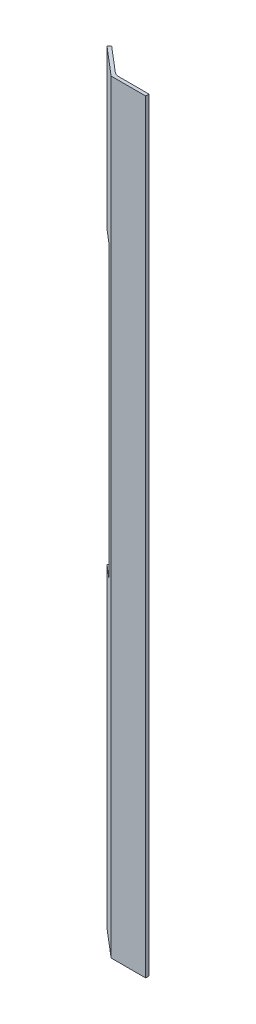
ISO-10303-21;
HEADER;
FILE_DESCRIPTION(('STEP AP214'),'2;1');
FILE_NAME('part.step','',(''),(''),'','','');
FILE_SCHEMA(('AUTOMOTIVE_DESIGN { 1 0 10303 214 1 1 1 1 }'));
ENDSEC;
DATA;
#1=APPLICATION_CONTEXT('core data for automotive mechanical design processes');
#2=APPLICATION_PROTOCOL_DEFINITION('international standard','automotive_design',2000,#1);
#3=PRODUCT_CONTEXT('',#1,'mechanical');
#4=PRODUCT('Part','Part','',(#3));
#5=PRODUCT_RELATED_PRODUCT_CATEGORY('part','',(#4));
#6=PRODUCT_DEFINITION_FORMATION('','',#4);
#7=PRODUCT_DEFINITION_CONTEXT('part definition',#1,'design');
#8=PRODUCT_DEFINITION('design','',#6,#7);
#9=PRODUCT_DEFINITION_SHAPE('','',#8);
#10=(LENGTH_UNIT() NAMED_UNIT(*) SI_UNIT(.MILLI.,.METRE.));
#11=(NAMED_UNIT(*) PLANE_ANGLE_UNIT() SI_UNIT($,.RADIAN.));
#12=(NAMED_UNIT(*) SI_UNIT($,.STERADIAN.) SOLID_ANGLE_UNIT());
#13=UNCERTAINTY_MEASURE_WITH_UNIT(LENGTH_MEASURE(1.E-05),#10,'distance_accuracy_value','');
#14=(GEOMETRIC_REPRESENTATION_CONTEXT(3) GLOBAL_UNCERTAINTY_ASSIGNED_CONTEXT((#13)) GLOBAL_UNIT_ASSIGNED_CONTEXT((#10,
#11,#12)) REPRESENTATION_CONTEXT('',''));
#15=CARTESIAN_POINT('',(0.,0.,0.));
#16=DIRECTION('',(0.,0.,1.));
#17=DIRECTION('',(1.,0.,0.));
#18=AXIS2_PLACEMENT_3D('',#15,#16,#17);
#19=CARTESIAN_POINT('',(-20.5084475648758,500.,-12.792651291369));
#20=DIRECTION('',(0.761435198515556,0.,0.648241034231539));
#21=DIRECTION('',(0.648241034231539,0.,-0.761435198515556));
#22=AXIS2_PLACEMENT_3D('',#19,#20,#21);
#23=PLANE('',#22);
#24=DIRECTION('',(0.,-1.,0.));
#25=VECTOR('',#24,1.);
#26=CARTESIAN_POINT('',(-19.2119654964128,500.,-14.3155216884001));
#27=LINE('',#26,#25);
#28=CARTESIAN_POINT('',(-19.2119654964128,500.,-14.3155216884001));
#29=VERTEX_POINT('',#28);
#30=CARTESIAN_POINT('',(-19.2119654964128,404.597692816823,-14.3155216884001));
#31=VERTEX_POINT('',#30);
#32=EDGE_CURVE('E158',#29,#31,#27,.T.);
#33=ORIENTED_EDGE('',*,*,#32,.T.);
#34=DIRECTION('',(-0.648241034231539,0.,0.761435198515556));
#35=VECTOR('',#34,1.);
#36=CARTESIAN_POINT('',(-20.5084475648758,404.597692816823,-12.792651291369));
#37=LINE('',#36,#35);
#38=CARTESIAN_POINT('',(-20.5084475648758,404.597692816823,-12.792651291369));
#39=VERTEX_POINT('',#38);
#40=EDGE_CURVE('E195',#31,#39,#37,.T.);
#41=ORIENTED_EDGE('',*,*,#40,.T.);
#42=DIRECTION('',(0.,-1.,0.));
#43=VECTOR('',#42,1.);
#44=CARTESIAN_POINT('',(-20.5084475648758,500.,-12.792651291369));
#45=LINE('',#44,#43);
#46=CARTESIAN_POINT('',(-20.5084475648758,500.,-12.792651291369));
#47=VERTEX_POINT('',#46);
#48=EDGE_CURVE('E154',#47,#39,#45,.T.);
#49=ORIENTED_EDGE('',*,*,#48,.F.);
#50=DIRECTION('',(-0.648241034231539,0.,0.761435198515556));
#51=VECTOR('',#50,1.);
#52=CARTESIAN_POINT('',(-20.5084475648758,500.,-12.792651291369));
#53=LINE('',#52,#51);
#54=EDGE_CURVE('E205',#29,#47,#53,.T.);
#55=ORIENTED_EDGE('',*,*,#54,.F.);
#56=EDGE_LOOP('',(#33,#41,#49,#55));
#57=FACE_BOUND('',#56,.T.);
#58=ADVANCED_FACE('F31',(#57),#23,.F.);
#59=CARTESIAN_POINT('',(-1.13337922469441,500.,-5.48688166985293));
#60=DIRECTION('',(0.,-1.,0.));
#61=DIRECTION('',(0.,0.,-1.));
#62=AXIS2_PLACEMENT_3D('',#59,#60,#61);
#63=CYLINDRICAL_SURFACE('',#62,5.);
#64=CARTESIAN_POINT('',(-1.13337922469441,40.,-5.48688166985293));
#65=DIRECTION('',(0.,-1.,0.));
#66=DIRECTION('',(0.,0.,-1.));
#67=AXIS2_PLACEMENT_3D('',#64,#65,#66);
#68=CIRCLE('',#67,5.);
#69=CARTESIAN_POINT('',(-1.13337922469441,40.,-0.486881669852926));
#70=VERTEX_POINT('',#69);
#71=CARTESIAN_POINT('',(-4.37520085986418,40.,-1.68023058448337));
#72=VERTEX_POINT('',#71);
#73=EDGE_CURVE('E133',#70,#72,#68,.T.);
#74=ORIENTED_EDGE('',*,*,#73,.T.);
#75=DIRECTION('',(0.,-1.,0.));
#76=VECTOR('',#75,1.);
#77=CARTESIAN_POINT('',(-4.37520085986418,500.,-1.68023058448337));
#78=LINE('',#77,#76);
#79=CARTESIAN_POINT('',(-4.37520085986418,500.,-1.68023058448337));
#80=VERTEX_POINT('',#79);
#81=EDGE_CURVE('E39',#80,#72,#78,.T.);
#82=ORIENTED_EDGE('',*,*,#81,.F.);
#83=CARTESIAN_POINT('',(-1.13337922469441,500.,-5.48688166985293));
#84=DIRECTION('',(0.,-1.,0.));
#85=DIRECTION('',(0.,0.,-1.));
#86=AXIS2_PLACEMENT_3D('',#83,#84,#85);
#87=CIRCLE('',#86,5.);
#88=CARTESIAN_POINT('',(-1.13337922469441,500.,-0.486881669852926));
#89=VERTEX_POINT('',#88);
#90=EDGE_CURVE('E149',#89,#80,#87,.T.);
#91=ORIENTED_EDGE('',*,*,#90,.F.);
#92=DIRECTION('',(0.,-1.,0.));
#93=VECTOR('',#92,1.);
#94=CARTESIAN_POINT('',(-1.13337922469441,500.,-0.486881669852926));
#95=LINE('',#94,#93);
#96=EDGE_CURVE('E129',#89,#70,#95,.T.);
#97=ORIENTED_EDGE('',*,*,#96,.T.);
#98=EDGE_LOOP('',(#74,#82,#91,#97));
#99=FACE_BOUND('',#98,.T.);
#100=ADVANCED_FACE('F33',(#99),#63,.F.);
#101=CARTESIAN_POINT('',(-19.2119654964128,500.,-14.3155216884001));
#102=DIRECTION('',(-0.648364327033953,0.,0.761330217073911));
#103=DIRECTION('',(0.761330217073912,0.,0.648364327033953));
#104=AXIS2_PLACEMENT_3D('',#101,#102,#103);
#105=PLANE('',#104);
#106=DIRECTION('',(0.,1.,0.));
#107=VECTOR('',#106,1.);
#108=CARTESIAN_POINT('',(-11.9974834467986,500.,-8.17152176025525));
#109=LINE('',#108,#107);
#110=CARTESIAN_POINT('',(-11.9974834467986,229.635760448528,-8.17152176025523));
#111=VERTEX_POINT('',#110);
#112=CARTESIAN_POINT('',(-11.9974834467986,404.597692816823,-8.17152176025524));
#113=VERTEX_POINT('',#112);
#114=EDGE_CURVE('E201',#111,#113,#109,.T.);
#115=ORIENTED_EDGE('',*,*,#114,.T.);
#116=DIRECTION('',(-0.761330217073912,0.,-0.648364327033953));
#117=VECTOR('',#116,1.);
#118=CARTESIAN_POINT('',(-19.2119654964128,404.597692816823,-14.3155216884001));
#119=LINE('',#118,#117);
#120=EDGE_CURVE('E137',#113,#31,#119,.T.);
#121=ORIENTED_EDGE('',*,*,#120,.T.);
#122=ORIENTED_EDGE('',*,*,#32,.F.);
#123=DIRECTION('',(-0.761330217073912,0.,-0.648364327033953));
#124=VECTOR('',#123,1.);
#125=CARTESIAN_POINT('',(-19.2119654964128,500.,-14.3155216884001));
#126=LINE('',#125,#124);
#127=EDGE_CURVE('E93',#80,#29,#126,.T.);
#128=ORIENTED_EDGE('',*,*,#127,.F.);
#129=ORIENTED_EDGE('',*,*,#81,.T.);
#130=DIRECTION('',(-0.761330217073912,0.,-0.648364327033953));
#131=VECTOR('',#130,1.);
#132=CARTESIAN_POINT('',(-19.2119654964128,40.,-14.3155216884001));
#133=LINE('',#132,#131);
#134=CARTESIAN_POINT('',(-19.2119654964128,40.,-14.3155216884001));
#135=VERTEX_POINT('',#134);
#136=EDGE_CURVE('E136',#72,#135,#133,.T.);
#137=ORIENTED_EDGE('',*,*,#136,.T.);
#138=CARTESIAN_POINT('',(-19.2119654964128,229.635760448528,-14.3155216884001));
#139=VERTEX_POINT('',#138);
#140=EDGE_CURVE('E157',#139,#135,#27,.T.);
#141=ORIENTED_EDGE('',*,*,#140,.F.);
#142=DIRECTION('',(0.761330217073912,0.,0.648364327033953));
#143=VECTOR('',#142,1.);
#144=CARTESIAN_POINT('',(-19.2119654964128,229.635760448528,-14.3155216884001));
#145=LINE('',#144,#143);
#146=EDGE_CURVE('E177',#139,#111,#145,.T.);
#147=ORIENTED_EDGE('',*,*,#146,.T.);
#148=EDGE_LOOP('',(#115,#121,#122,#128,#129,#137,#141,#147));
#149=FACE_BOUND('',#148,.T.);
#150=ADVANCED_FACE('F162',(#149),#105,.F.);
#151=CARTESIAN_POINT('',(-20.5084475648758,229.635760448528,-12.792651291369));
#152=VERTEX_POINT('',#151);
#153=CARTESIAN_POINT('',(-20.5084475648758,40.,-12.792651291369));
#154=VERTEX_POINT('',#153);
#155=EDGE_CURVE('E153',#152,#154,#45,.T.);
#156=ORIENTED_EDGE('',*,*,#155,.F.);
#157=DIRECTION('',(0.648241034231539,0.,-0.761435198515556));
#158=VECTOR('',#157,1.);
#159=CARTESIAN_POINT('',(-20.5084475648758,229.635760448528,-12.792651291369));
#160=LINE('',#159,#158);
#161=EDGE_CURVE('E46',#152,#139,#160,.T.);
#162=ORIENTED_EDGE('',*,*,#161,.T.);
#163=ORIENTED_EDGE('',*,*,#140,.T.);
#164=DIRECTION('',(-0.648241034231539,0.,0.761435198515556));
#165=VECTOR('',#164,1.);
#166=CARTESIAN_POINT('',(-20.5084475648758,40.,-12.792651291369));
#167=LINE('',#166,#165);
#168=EDGE_CURVE('E140',#135,#154,#167,.T.);
#169=ORIENTED_EDGE('',*,*,#168,.T.);
#170=EDGE_LOOP('',(#156,#162,#163,#169));
#171=FACE_BOUND('',#170,.T.);
#172=ADVANCED_FACE('F173',(#171),#23,.F.);
#173=CARTESIAN_POINT('',(-20.5084475648758,500.,-12.792651291369));
#174=DIRECTION('',(0.64824103423154,0.,-0.761435198515556));
#175=DIRECTION('',(-0.761435198515556,0.,-0.64824103423154));
#176=AXIS2_PLACEMENT_3D('',#173,#174,#175);
#177=PLANE('',#176);
#178=ORIENTED_EDGE('',*,*,#48,.T.);
#179=DIRECTION('',(-0.761435198515555,0.,-0.64824103423154));
#180=VECTOR('',#179,1.);
#181=CARTESIAN_POINT('',(-24.575500265484,404.597692816823,-16.2551001695614));
#182=LINE('',#181,#180);
#183=CARTESIAN_POINT('',(-13.2929707896022,404.597692816823,-6.64981978529245));
#184=VERTEX_POINT('',#183);
#185=EDGE_CURVE('E193',#184,#39,#182,.T.);
#186=ORIENTED_EDGE('',*,*,#185,.F.);
#187=DIRECTION('',(0.,1.,0.));
#188=VECTOR('',#187,1.);
#189=CARTESIAN_POINT('',(-13.2929707896022,404.597692816823,-6.64981978529245));
#190=LINE('',#189,#188);
#191=CARTESIAN_POINT('',(-13.2929707896022,229.635760448528,-6.64981978529243));
#192=VERTEX_POINT('',#191);
#193=EDGE_CURVE('E219',#192,#184,#190,.T.);
#194=ORIENTED_EDGE('',*,*,#193,.F.);
#195=DIRECTION('',(-0.761435198515556,0.,-0.64824103423154));
#196=VECTOR('',#195,1.);
#197=CARTESIAN_POINT('',(-20.5084475648758,229.635760448528,-12.792651291369));
#198=LINE('',#197,#196);
#199=EDGE_CURVE('E11',#192,#152,#198,.T.);
#200=ORIENTED_EDGE('',*,*,#199,.T.);
#201=ORIENTED_EDGE('',*,*,#155,.T.);
#202=DIRECTION('',(0.761435198515555,0.,0.64824103423154));
#203=VECTOR('',#202,1.);
#204=CARTESIAN_POINT('',(-20.5084475648758,40.,-12.792651291369));
#205=LINE('',#204,#203);
#206=CARTESIAN_POINT('',(-3.70464164013991,40.,1.51311833014707));
#207=VERTEX_POINT('',#206);
#208=EDGE_CURVE('E143',#154,#207,#205,.T.);
#209=ORIENTED_EDGE('',*,*,#208,.T.);
#210=DIRECTION('',(0.,-1.,0.));
#211=VECTOR('',#210,1.);
#212=CARTESIAN_POINT('',(-3.70464164013991,500.,1.51311833014707));
#213=LINE('',#212,#211);
#214=CARTESIAN_POINT('',(-3.70464164013991,500.,1.51311833014707));
#215=VERTEX_POINT('',#214);
#216=EDGE_CURVE('E124',#215,#207,#213,.T.);
#217=ORIENTED_EDGE('',*,*,#216,.F.);
#218=DIRECTION('',(0.761435198515555,0.,0.64824103423154));
#219=VECTOR('',#218,1.);
#220=CARTESIAN_POINT('',(-20.5084475648758,500.,-12.792651291369));
#221=LINE('',#220,#219);
#222=EDGE_CURVE('E112',#47,#215,#221,.T.);
#223=ORIENTED_EDGE('',*,*,#222,.F.);
#224=EDGE_LOOP('',(#178,#186,#194,#200,#201,#209,#217,#223));
#225=FACE_BOUND('',#224,.T.);
#226=ADVANCED_FACE('F226',(#225),#177,.F.);
#227=CARTESIAN_POINT('',(-3.70464164013991,500.,1.51311833014707));
#228=DIRECTION('',(0.,0.,-1.));
#229=DIRECTION('',(-1.,0.,0.));
#230=AXIS2_PLACEMENT_3D('',#227,#228,#229);
#231=PLANE('',#230);
#232=DIRECTION('',(1.,0.,0.));
#233=VECTOR('',#232,1.);
#234=CARTESIAN_POINT('',(-3.70464164013991,40.,1.51311833014707));
#235=LINE('',#234,#233);
#236=CARTESIAN_POINT('',(17.1228290420735,40.,1.51311833014707));
#237=VERTEX_POINT('',#236);
#238=EDGE_CURVE('E121',#207,#237,#235,.T.);
#239=ORIENTED_EDGE('',*,*,#238,.T.);
#240=DIRECTION('',(0.,-1.,0.));
#241=VECTOR('',#240,1.);
#242=CARTESIAN_POINT('',(17.1228290420735,500.,1.51311833014707));
#243=LINE('',#242,#241);
#244=CARTESIAN_POINT('',(17.1228290420735,500.,1.51311833014707));
#245=VERTEX_POINT('',#244);
#246=EDGE_CURVE('E118',#245,#237,#243,.T.);
#247=ORIENTED_EDGE('',*,*,#246,.F.);
#248=DIRECTION('',(1.,0.,0.));
#249=VECTOR('',#248,1.);
#250=CARTESIAN_POINT('',(-3.70464164013991,500.,1.51311833014707));
#251=LINE('',#250,#249);
#252=EDGE_CURVE('E105',#215,#245,#251,.T.);
#253=ORIENTED_EDGE('',*,*,#252,.F.);
#254=ORIENTED_EDGE('',*,*,#216,.T.);
#255=EDGE_LOOP('',(#239,#247,#253,#254));
#256=FACE_BOUND('',#255,.T.);
#257=ADVANCED_FACE('F119',(#256),#231,.F.);
#258=CARTESIAN_POINT('',(17.1228290420735,500.,1.51311833014707));
#259=DIRECTION('',(-1.,0.,0.));
#260=DIRECTION('',(0.,0.,1.));
#261=AXIS2_PLACEMENT_3D('',#258,#259,#260);
#262=PLANE('',#261);
#263=DIRECTION('',(0.,0.,-1.));
#264=VECTOR('',#263,1.);
#265=CARTESIAN_POINT('',(17.1228290420735,40.,1.51311833014707));
#266=LINE('',#265,#264);
#267=CARTESIAN_POINT('',(17.1228290420735,40.,-0.486881669852926));
#268=VERTEX_POINT('',#267);
#269=EDGE_CURVE('E146',#237,#268,#266,.T.);
#270=ORIENTED_EDGE('',*,*,#269,.T.);
#271=DIRECTION('',(0.,-1.,0.));
#272=VECTOR('',#271,1.);
#273=CARTESIAN_POINT('',(17.1228290420735,500.,-0.486881669852926));
#274=LINE('',#273,#272);
#275=CARTESIAN_POINT('',(17.1228290420735,500.,-0.486881669852926));
#276=VERTEX_POINT('',#275);
#277=EDGE_CURVE('E125',#276,#268,#274,.T.);
#278=ORIENTED_EDGE('',*,*,#277,.F.);
#279=DIRECTION('',(0.,0.,-1.));
#280=VECTOR('',#279,1.);
#281=CARTESIAN_POINT('',(17.1228290420735,500.,1.51311833014707));
#282=LINE('',#281,#280);
#283=EDGE_CURVE('E109',#245,#276,#282,.T.);
#284=ORIENTED_EDGE('',*,*,#283,.F.);
#285=ORIENTED_EDGE('',*,*,#246,.T.);
#286=EDGE_LOOP('',(#270,#278,#284,#285));
#287=FACE_BOUND('',#286,.T.);
#288=ADVANCED_FACE('F127',(#287),#262,.F.);
#289=CARTESIAN_POINT('',(-1.13337922469441,500.,-0.486881669852926));
#290=DIRECTION('',(0.,0.,1.));
#291=DIRECTION('',(1.,0.,0.));
#292=AXIS2_PLACEMENT_3D('',#289,#290,#291);
#293=PLANE('',#292);
#294=DIRECTION('',(-1.,0.,0.));
#295=VECTOR('',#294,1.);
#296=CARTESIAN_POINT('',(-1.13337922469441,40.,-0.486881669852926));
#297=LINE('',#296,#295);
#298=EDGE_CURVE('E84',#268,#70,#297,.T.);
#299=ORIENTED_EDGE('',*,*,#298,.T.);
#300=ORIENTED_EDGE('',*,*,#96,.F.);
#301=DIRECTION('',(-1.,0.,0.));
#302=VECTOR('',#301,1.);
#303=CARTESIAN_POINT('',(-1.13337922469441,500.,-0.486881669852926));
#304=LINE('',#303,#302);
#305=EDGE_CURVE('E54',#276,#89,#304,.T.);
#306=ORIENTED_EDGE('',*,*,#305,.F.);
#307=ORIENTED_EDGE('',*,*,#277,.T.);
#308=EDGE_LOOP('',(#299,#300,#306,#307));
#309=FACE_BOUND('',#308,.T.);
#310=ADVANCED_FACE('F227',(#309),#293,.F.);
#311=CARTESIAN_POINT('',(-1.13337922469441,500.,-5.48688166985293));
#312=DIRECTION('',(0.,-1.,0.));
#313=DIRECTION('',(0.,0.,-1.));
#314=AXIS2_PLACEMENT_3D('',#311,#312,#313);
#315=PLANE('',#314);
#316=ORIENTED_EDGE('',*,*,#90,.T.);
#317=ORIENTED_EDGE('',*,*,#127,.T.);
#318=ORIENTED_EDGE('',*,*,#54,.T.);
#319=ORIENTED_EDGE('',*,*,#222,.T.);
#320=ORIENTED_EDGE('',*,*,#252,.T.);
#321=ORIENTED_EDGE('',*,*,#283,.T.);
#322=ORIENTED_EDGE('',*,*,#305,.T.);
#323=EDGE_LOOP('',(#316,#317,#318,#319,#320,#321,#322));
#324=FACE_BOUND('',#323,.T.);
#325=ADVANCED_FACE('F107',(#324),#315,.F.);
#326=CARTESIAN_POINT('',(-1.13337922469441,40.,-5.48688166985293));
#327=DIRECTION('',(0.,-1.,0.));
#328=DIRECTION('',(0.,0.,-1.));
#329=AXIS2_PLACEMENT_3D('',#326,#327,#328);
#330=PLANE('',#329);
#331=ORIENTED_EDGE('',*,*,#73,.F.);
#332=ORIENTED_EDGE('',*,*,#298,.F.);
#333=ORIENTED_EDGE('',*,*,#269,.F.);
#334=ORIENTED_EDGE('',*,*,#238,.F.);
#335=ORIENTED_EDGE('',*,*,#208,.F.);
#336=ORIENTED_EDGE('',*,*,#168,.F.);
#337=ORIENTED_EDGE('',*,*,#136,.F.);
#338=EDGE_LOOP('',(#331,#332,#333,#334,#335,#336,#337));
#339=FACE_BOUND('',#338,.T.);
#340=ADVANCED_FACE('F169',(#339),#330,.T.);
#341=CARTESIAN_POINT('',(-8.01054024382504,404.597692816823,-35.7125904493096));
#342=DIRECTION('',(0.,1.,0.));
#343=DIRECTION('',(0.,0.,1.));
#344=AXIS2_PLACEMENT_3D('',#341,#342,#343);
#345=PLANE('',#344);
#346=DIRECTION('',(-0.64824103423154,0.,0.761435198515555));
#347=VECTOR('',#346,1.);
#348=CARTESIAN_POINT('',(3.27198923205669,404.597692816823,-26.1073100650406));
#349=LINE('',#348,#347);
#350=EDGE_CURVE('E213',#113,#184,#349,.T.);
#351=ORIENTED_EDGE('',*,*,#350,.T.);
#352=ORIENTED_EDGE('',*,*,#185,.T.);
#353=ORIENTED_EDGE('',*,*,#40,.F.);
#354=ORIENTED_EDGE('',*,*,#120,.F.);
#355=EDGE_LOOP('',(#351,#352,#353,#354));
#356=FACE_BOUND('',#355,.T.);
#357=ADVANCED_FACE('F197',(#356),#345,.F.);
#358=CARTESIAN_POINT('',(3.27198923205669,404.597692816823,-26.1073100650406));
#359=DIRECTION('',(0.761435198515555,0.,0.64824103423154));
#360=DIRECTION('',(0.64824103423154,0.,-0.761435198515556));
#361=AXIS2_PLACEMENT_3D('',#358,#359,#360);
#362=PLANE('',#361);
#363=DIRECTION('',(-0.64824103423154,0.,0.761435198515555));
#364=VECTOR('',#363,1.);
#365=CARTESIAN_POINT('',(3.2719892320567,229.635760448528,-26.1073100650406));
#366=LINE('',#365,#364);
#367=EDGE_CURVE('E214',#111,#192,#366,.T.);
#368=ORIENTED_EDGE('',*,*,#367,.T.);
#369=ORIENTED_EDGE('',*,*,#193,.T.);
#370=ORIENTED_EDGE('',*,*,#350,.F.);
#371=ORIENTED_EDGE('',*,*,#114,.F.);
#372=EDGE_LOOP('',(#368,#369,#370,#371));
#373=FACE_BOUND('',#372,.T.);
#374=ADVANCED_FACE('F223',(#373),#362,.F.);
#375=CARTESIAN_POINT('',(-8.01054024382503,229.635760448528,-35.7125904493096));
#376=DIRECTION('',(0.,-1.,0.));
#377=DIRECTION('',(0.,0.,-1.));
#378=AXIS2_PLACEMENT_3D('',#375,#376,#377);
#379=PLANE('',#378);
#380=ORIENTED_EDGE('',*,*,#161,.F.);
#381=ORIENTED_EDGE('',*,*,#199,.F.);
#382=ORIENTED_EDGE('',*,*,#367,.F.);
#383=ORIENTED_EDGE('',*,*,#146,.F.);
#384=EDGE_LOOP('',(#380,#381,#382,#383));
#385=FACE_BOUND('',#384,.T.);
#386=ADVANCED_FACE('F308',(#385),#379,.F.);
#387=CLOSED_SHELL('',(#58,#100,#150,#172,#226,#257,#288,#310,#325,#340,#357,#374,#386));
#388=MANIFOLD_SOLID_BREP('B2',#387);
#389=ADVANCED_BREP_SHAPE_REPRESENTATION('',(#18,#388),#14);
#390=SHAPE_DEFINITION_REPRESENTATION(#9,#389);
ENDSEC;
END-ISO-10303-21;
